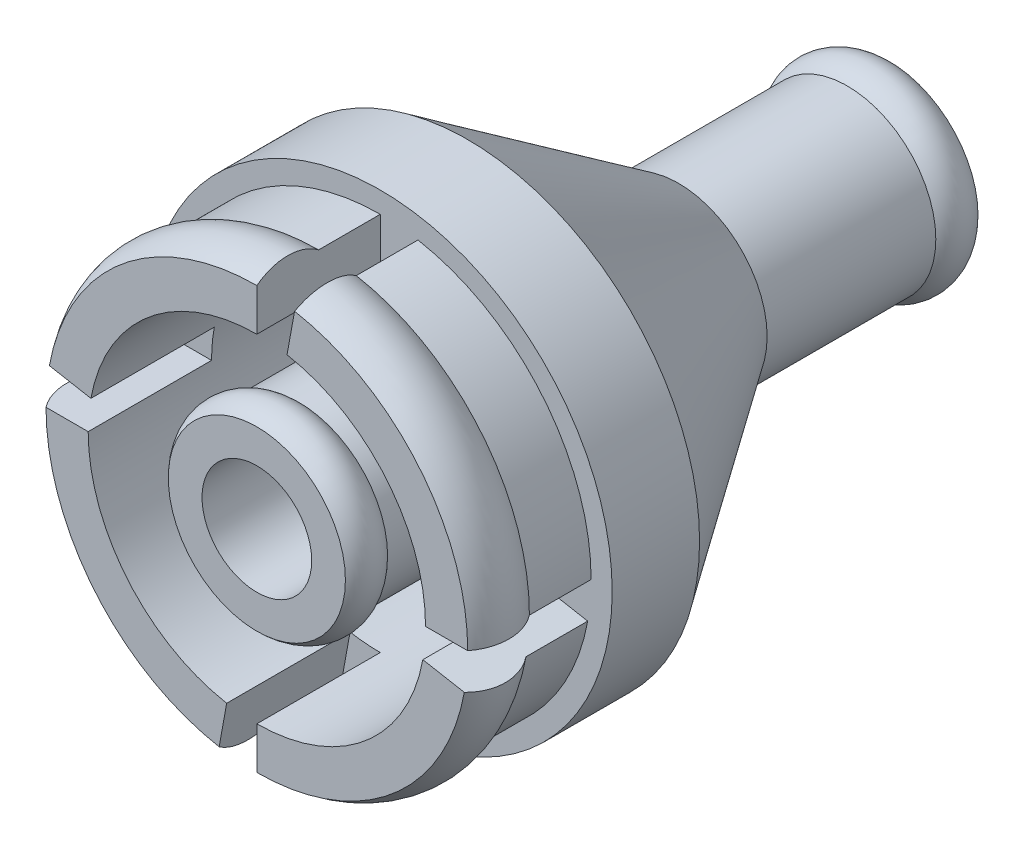
ISO-10303-21;
HEADER;
FILE_DESCRIPTION(('STEP AP214'),'2;1');
FILE_NAME('part.step','',(''),(''),'','','');
FILE_SCHEMA(('AUTOMOTIVE_DESIGN { 1 0 10303 214 1 1 1 1 }'));
ENDSEC;
DATA;
#1=APPLICATION_CONTEXT('core data for automotive mechanical design processes');
#2=APPLICATION_PROTOCOL_DEFINITION('international standard','automotive_design',2000,#1);
#3=PRODUCT_CONTEXT('',#1,'mechanical');
#4=PRODUCT('Part','Part','',(#3));
#5=PRODUCT_RELATED_PRODUCT_CATEGORY('part','',(#4));
#6=PRODUCT_DEFINITION_FORMATION('','',#4);
#7=PRODUCT_DEFINITION_CONTEXT('part definition',#1,'design');
#8=PRODUCT_DEFINITION('design','',#6,#7);
#9=PRODUCT_DEFINITION_SHAPE('','',#8);
#10=(LENGTH_UNIT() NAMED_UNIT(*) SI_UNIT(.MILLI.,.METRE.));
#11=(NAMED_UNIT(*) PLANE_ANGLE_UNIT() SI_UNIT($,.RADIAN.));
#12=(NAMED_UNIT(*) SI_UNIT($,.STERADIAN.) SOLID_ANGLE_UNIT());
#13=UNCERTAINTY_MEASURE_WITH_UNIT(LENGTH_MEASURE(1.E-05),#10,'distance_accuracy_value','');
#14=(GEOMETRIC_REPRESENTATION_CONTEXT(3) GLOBAL_UNCERTAINTY_ASSIGNED_CONTEXT((#13)) GLOBAL_UNIT_ASSIGNED_CONTEXT((#10,
#11,#12)) REPRESENTATION_CONTEXT('',''));
#15=CARTESIAN_POINT('',(0.,0.,0.));
#16=DIRECTION('',(0.,0.,1.));
#17=DIRECTION('',(1.,0.,0.));
#18=AXIS2_PLACEMENT_3D('',#15,#16,#17);
#19=CARTESIAN_POINT('',(0.,0.,15.));
#20=DIRECTION('',(0.,0.,1.));
#21=DIRECTION('',(1.,0.,0.));
#22=AXIS2_PLACEMENT_3D('',#19,#20,#21);
#23=CYLINDRICAL_SURFACE('',#22,5.);
#24=DIRECTION('',(0.,0.,1.));
#25=VECTOR('',#24,1.);
#26=CARTESIAN_POINT('',(-0.894427190999915,-4.91934955049954,15.));
#27=LINE('',#26,#25);
#28=CARTESIAN_POINT('',(-0.894427190999916,-4.91934955049954,13.5370032541715));
#29=VERTEX_POINT('',#28);
#30=CARTESIAN_POINT('',(-0.894427190999915,-4.91934955049954,12.0740065083429));
#31=VERTEX_POINT('',#30);
#32=EDGE_CURVE('E335',#29,#31,#27,.F.);
#33=ORIENTED_EDGE('',*,*,#32,.F.);
#34=CARTESIAN_POINT('',(0.,0.,13.5370032541715));
#35=DIRECTION('',(0.,0.,1.));
#36=DIRECTION('',(1.,0.,0.));
#37=AXIS2_PLACEMENT_3D('',#34,#35,#36);
#38=CIRCLE('',#37,5.);
#39=CARTESIAN_POINT('',(-5.,0.,13.5370032541715));
#40=VERTEX_POINT('',#39);
#41=EDGE_CURVE('E425',#40,#29,#38,.T.);
#42=ORIENTED_EDGE('',*,*,#41,.F.);
#43=DIRECTION('',(0.,0.,1.));
#44=VECTOR('',#43,1.);
#45=CARTESIAN_POINT('',(-5.,0.,15.));
#46=LINE('',#45,#44);
#47=CARTESIAN_POINT('',(-5.,0.,12.0740065083429));
#48=VERTEX_POINT('',#47);
#49=EDGE_CURVE('E318',#48,#40,#46,.T.);
#50=ORIENTED_EDGE('',*,*,#49,.F.);
#51=CARTESIAN_POINT('',(0.,0.,12.0740065083429));
#52=DIRECTION('',(0.,0.,1.));
#53=DIRECTION('',(1.,0.,0.));
#54=AXIS2_PLACEMENT_3D('',#51,#52,#53);
#55=CIRCLE('',#54,5.);
#56=EDGE_CURVE('E422',#48,#31,#55,.T.);
#57=ORIENTED_EDGE('',*,*,#56,.T.);
#58=EDGE_LOOP('',(#33,#42,#50,#57));
#59=FACE_BOUND('',#58,.T.);
#60=ADVANCED_FACE('F39',(#59),#23,.T.);
#61=DIRECTION('',(0.,0.,1.));
#62=VECTOR('',#61,1.);
#63=CARTESIAN_POINT('',(-4.91934955049954,0.894427190999915,15.));
#64=LINE('',#63,#62);
#65=CARTESIAN_POINT('',(-4.91934955049954,0.894427190999915,13.5370032541715));
#66=VERTEX_POINT('',#65);
#67=CARTESIAN_POINT('',(-4.91934955049954,0.894427190999915,12.0740065083429));
#68=VERTEX_POINT('',#67);
#69=EDGE_CURVE('E324',#66,#68,#64,.F.);
#70=ORIENTED_EDGE('',*,*,#69,.F.);
#71=CARTESIAN_POINT('',(0.,5.,13.5370032541715));
#72=VERTEX_POINT('',#71);
#73=EDGE_CURVE('E416',#72,#66,#38,.T.);
#74=ORIENTED_EDGE('',*,*,#73,.F.);
#75=DIRECTION('',(0.,0.,1.));
#76=VECTOR('',#75,1.);
#77=CARTESIAN_POINT('',(0.,5.,15.));
#78=LINE('',#77,#76);
#79=CARTESIAN_POINT('',(0.,5.,12.0740065083429));
#80=VERTEX_POINT('',#79);
#81=EDGE_CURVE('E307',#80,#72,#78,.T.);
#82=ORIENTED_EDGE('',*,*,#81,.F.);
#83=EDGE_CURVE('E720',#80,#68,#55,.T.);
#84=ORIENTED_EDGE('',*,*,#83,.T.);
#85=EDGE_LOOP('',(#70,#74,#82,#84));
#86=FACE_BOUND('',#85,.T.);
#87=ADVANCED_FACE('F367',(#86),#23,.T.);
#88=DIRECTION('',(0.,0.,1.));
#89=VECTOR('',#88,1.);
#90=CARTESIAN_POINT('',(0.894427190999915,4.91934955049954,15.));
#91=LINE('',#90,#89);
#92=CARTESIAN_POINT('',(0.894427190999915,4.91934955049954,13.5370032541715));
#93=VERTEX_POINT('',#92);
#94=CARTESIAN_POINT('',(0.894427190999915,4.91934955049954,12.0740065083429));
#95=VERTEX_POINT('',#94);
#96=EDGE_CURVE('E313',#93,#95,#91,.F.);
#97=ORIENTED_EDGE('',*,*,#96,.F.);
#98=CARTESIAN_POINT('',(5.,0.,13.5370032541715));
#99=VERTEX_POINT('',#98);
#100=EDGE_CURVE('E404',#99,#93,#38,.T.);
#101=ORIENTED_EDGE('',*,*,#100,.F.);
#102=DIRECTION('',(0.,0.,1.));
#103=VECTOR('',#102,1.);
#104=CARTESIAN_POINT('',(5.,0.,15.));
#105=LINE('',#104,#103);
#106=CARTESIAN_POINT('',(5.,0.,12.0740065083429));
#107=VERTEX_POINT('',#106);
#108=EDGE_CURVE('E294',#107,#99,#105,.T.);
#109=ORIENTED_EDGE('',*,*,#108,.F.);
#110=EDGE_CURVE('E406',#107,#95,#55,.T.);
#111=ORIENTED_EDGE('',*,*,#110,.T.);
#112=EDGE_LOOP('',(#97,#101,#109,#111));
#113=FACE_BOUND('',#112,.T.);
#114=ADVANCED_FACE('F374',(#113),#23,.T.);
#115=CARTESIAN_POINT('',(0.,0.,14.2685016270857));
#116=DIRECTION('',(0.,0.,1.));
#117=DIRECTION('',(1.,0.,0.));
#118=AXIS2_PLACEMENT_3D('',#115,#116,#117);
#119=TOROIDAL_SURFACE('',#118,4.04669276022607,1.2016174778113);
#120=CARTESIAN_POINT('',(-0.72389440767374,-3.98141924220557,14.2685016270857));
#121=DIRECTION('',(-0.983869910099908,0.178885438199983,0.));
#122=DIRECTION('',(-0.178885438199983,-0.983869910099908,0.));
#123=AXIS2_PLACEMENT_3D('',#120,#121,#122);
#124=CIRCLE('',#123,1.2016174778113);
#125=CARTESIAN_POINT('',(-0.894427190999915,-4.91934955049954,15.));
#126=VERTEX_POINT('',#125);
#127=EDGE_CURVE('E332',#126,#29,#124,.F.);
#128=ORIENTED_EDGE('',*,*,#127,.F.);
#129=CARTESIAN_POINT('',(0.,0.,15.));
#130=DIRECTION('',(0.,0.,1.));
#131=DIRECTION('',(1.,0.,0.));
#132=AXIS2_PLACEMENT_3D('',#129,#130,#131);
#133=CIRCLE('',#132,5.);
#134=CARTESIAN_POINT('',(-5.,0.,15.));
#135=VERTEX_POINT('',#134);
#136=EDGE_CURVE('E440',#135,#126,#133,.T.);
#137=ORIENTED_EDGE('',*,*,#136,.F.);
#138=CARTESIAN_POINT('',(-4.04669276022607,0.,14.2685016270857));
#139=DIRECTION('',(0.,-1.,0.));
#140=DIRECTION('',(0.,0.,-1.));
#141=AXIS2_PLACEMENT_3D('',#138,#139,#140);
#142=CIRCLE('',#141,1.2016174778113);
#143=EDGE_CURVE('E62',#40,#135,#142,.F.);
#144=ORIENTED_EDGE('',*,*,#143,.F.);
#145=ORIENTED_EDGE('',*,*,#41,.T.);
#146=EDGE_LOOP('',(#128,#137,#144,#145));
#147=FACE_BOUND('',#146,.T.);
#148=ADVANCED_FACE('F388',(#147),#119,.T.);
#149=CARTESIAN_POINT('',(-3.98141924220557,0.72389440767374,14.2685016270857));
#150=DIRECTION('',(0.178885438199983,0.983869910099908,0.));
#151=DIRECTION('',(-0.983869910099908,0.178885438199983,0.));
#152=AXIS2_PLACEMENT_3D('',#149,#150,#151);
#153=CIRCLE('',#152,1.2016174778113);
#154=CARTESIAN_POINT('',(-4.91934955049954,0.894427190999915,15.));
#155=VERTEX_POINT('',#154);
#156=EDGE_CURVE('E321',#155,#66,#153,.F.);
#157=ORIENTED_EDGE('',*,*,#156,.F.);
#158=CARTESIAN_POINT('',(0.,5.,15.));
#159=VERTEX_POINT('',#158);
#160=EDGE_CURVE('E237',#159,#155,#133,.T.);
#161=ORIENTED_EDGE('',*,*,#160,.F.);
#162=CARTESIAN_POINT('',(0.,4.04669276022607,14.2685016270857));
#163=DIRECTION('',(-1.,0.,0.));
#164=DIRECTION('',(0.,-1.,0.));
#165=AXIS2_PLACEMENT_3D('',#162,#163,#164);
#166=CIRCLE('',#165,1.2016174778113);
#167=EDGE_CURVE('E304',#72,#159,#166,.F.);
#168=ORIENTED_EDGE('',*,*,#167,.F.);
#169=ORIENTED_EDGE('',*,*,#73,.T.);
#170=EDGE_LOOP('',(#157,#161,#168,#169));
#171=FACE_BOUND('',#170,.T.);
#172=ADVANCED_FACE('F397',(#171),#119,.T.);
#173=CARTESIAN_POINT('',(0.72389440767374,3.98141924220557,14.2685016270857));
#174=DIRECTION('',(0.983869910099908,-0.178885438199983,0.));
#175=DIRECTION('',(0.178885438199983,0.983869910099908,0.));
#176=AXIS2_PLACEMENT_3D('',#173,#174,#175);
#177=CIRCLE('',#176,1.2016174778113);
#178=CARTESIAN_POINT('',(0.894427190999915,4.91934955049954,15.));
#179=VERTEX_POINT('',#178);
#180=EDGE_CURVE('E310',#179,#93,#177,.F.);
#181=ORIENTED_EDGE('',*,*,#180,.F.);
#182=CARTESIAN_POINT('',(5.,0.,15.));
#183=VERTEX_POINT('',#182);
#184=EDGE_CURVE('E429',#183,#179,#133,.T.);
#185=ORIENTED_EDGE('',*,*,#184,.F.);
#186=CARTESIAN_POINT('',(4.04669276022607,0.,14.2685016270857));
#187=DIRECTION('',(0.,1.,0.));
#188=DIRECTION('',(-1.,0.,0.));
#189=AXIS2_PLACEMENT_3D('',#186,#187,#188);
#190=CIRCLE('',#189,1.2016174778113);
#191=EDGE_CURVE('E291',#99,#183,#190,.F.);
#192=ORIENTED_EDGE('',*,*,#191,.F.);
#193=ORIENTED_EDGE('',*,*,#100,.T.);
#194=EDGE_LOOP('',(#181,#185,#192,#193));
#195=FACE_BOUND('',#194,.T.);
#196=ADVANCED_FACE('F389',(#195),#119,.T.);
#197=CARTESIAN_POINT('',(0.,0.,15.));
#198=DIRECTION('',(0.,0.,1.));
#199=DIRECTION('',(1.,0.,0.));
#200=AXIS2_PLACEMENT_3D('',#197,#198,#199);
#201=PLANE('',#200);
#202=DIRECTION('',(-0.178885438199983,-0.983869910099907,0.));
#203=VECTOR('',#202,1.);
#204=CARTESIAN_POINT('',(-0.983869910099907,-5.41128450554949,15.));
#205=LINE('',#204,#203);
#206=CARTESIAN_POINT('',(-0.715541752799932,-3.93547964039963,15.));
#207=VERTEX_POINT('',#206);
#208=EDGE_CURVE('E193',#207,#126,#205,.T.);
#209=ORIENTED_EDGE('',*,*,#208,.F.);
#210=CARTESIAN_POINT('',(0.,0.,15.));
#211=DIRECTION('',(0.,0.,1.));
#212=DIRECTION('',(1.,0.,0.));
#213=AXIS2_PLACEMENT_3D('',#210,#211,#212);
#214=CIRCLE('',#213,4.);
#215=CARTESIAN_POINT('',(-4.,0.,15.));
#216=VERTEX_POINT('',#215);
#217=EDGE_CURVE('E199',#216,#207,#214,.T.);
#218=ORIENTED_EDGE('',*,*,#217,.F.);
#219=DIRECTION('',(1.,0.,0.));
#220=VECTOR('',#219,1.);
#221=CARTESIAN_POINT('',(0.,0.,15.));
#222=LINE('',#221,#220);
#223=EDGE_CURVE('E48',#135,#216,#222,.T.);
#224=ORIENTED_EDGE('',*,*,#223,.F.);
#225=ORIENTED_EDGE('',*,*,#136,.T.);
#226=EDGE_LOOP('',(#209,#218,#224,#225));
#227=FACE_BOUND('',#226,.T.);
#228=ADVANCED_FACE('F537',(#227),#201,.T.);
#229=DIRECTION('',(-0.983869910099907,0.178885438199983,0.));
#230=VECTOR('',#229,1.);
#231=CARTESIAN_POINT('',(-5.41128450554949,0.983869910099907,15.));
#232=LINE('',#231,#230);
#233=CARTESIAN_POINT('',(-3.93547964039963,0.715541752799932,15.));
#234=VERTEX_POINT('',#233);
#235=EDGE_CURVE('E236',#234,#155,#232,.T.);
#236=ORIENTED_EDGE('',*,*,#235,.F.);
#237=CARTESIAN_POINT('',(0.,4.,15.));
#238=VERTEX_POINT('',#237);
#239=EDGE_CURVE('E206',#238,#234,#214,.T.);
#240=ORIENTED_EDGE('',*,*,#239,.F.);
#241=DIRECTION('',(0.,-1.,0.));
#242=VECTOR('',#241,1.);
#243=CARTESIAN_POINT('',(0.,0.,15.));
#244=LINE('',#243,#242);
#245=EDGE_CURVE('E234',#159,#238,#244,.T.);
#246=ORIENTED_EDGE('',*,*,#245,.F.);
#247=ORIENTED_EDGE('',*,*,#160,.T.);
#248=EDGE_LOOP('',(#236,#240,#246,#247));
#249=FACE_BOUND('',#248,.T.);
#250=ADVANCED_FACE('F232',(#249),#201,.T.);
#251=DIRECTION('',(0.178885438199983,0.983869910099908,0.));
#252=VECTOR('',#251,1.);
#253=CARTESIAN_POINT('',(0.983869910099906,5.41128450554949,15.));
#254=LINE('',#253,#252);
#255=CARTESIAN_POINT('',(0.715541752799932,3.93547964039963,15.));
#256=VERTEX_POINT('',#255);
#257=EDGE_CURVE('E266',#256,#179,#254,.T.);
#258=ORIENTED_EDGE('',*,*,#257,.F.);
#259=CARTESIAN_POINT('',(4.,0.,15.));
#260=VERTEX_POINT('',#259);
#261=EDGE_CURVE('E202',#260,#256,#214,.T.);
#262=ORIENTED_EDGE('',*,*,#261,.F.);
#263=DIRECTION('',(-1.,0.,0.));
#264=VECTOR('',#263,1.);
#265=CARTESIAN_POINT('',(0.,0.,15.));
#266=LINE('',#265,#264);
#267=EDGE_CURVE('E734',#183,#260,#266,.T.);
#268=ORIENTED_EDGE('',*,*,#267,.F.);
#269=ORIENTED_EDGE('',*,*,#184,.T.);
#270=EDGE_LOOP('',(#258,#262,#268,#269));
#271=FACE_BOUND('',#270,.T.);
#272=ADVANCED_FACE('F553',(#271),#201,.T.);
#273=CARTESIAN_POINT('',(0.,0.,15.));
#274=DIRECTION('',(0.,0.,1.));
#275=DIRECTION('',(1.,0.,0.));
#276=AXIS2_PLACEMENT_3D('',#273,#274,#275);
#277=CIRCLE('',#276,1.3);
#278=CARTESIAN_POINT('',(1.3,0.,15.));
#279=VERTEX_POINT('',#278);
#280=EDGE_CURVE('E730',#279,#279,#277,.T.);
#281=ORIENTED_EDGE('',*,*,#280,.F.);
#282=EDGE_LOOP('',(#281));
#283=FACE_BOUND('',#282,.T.);
#284=CARTESIAN_POINT('',(0.,0.,15.));
#285=DIRECTION('',(0.,0.,1.));
#286=DIRECTION('',(1.,0.,0.));
#287=AXIS2_PLACEMENT_3D('',#284,#285,#286);
#288=CIRCLE('',#287,2.1);
#289=CARTESIAN_POINT('',(2.1,0.,15.));
#290=VERTEX_POINT('',#289);
#291=EDGE_CURVE('E213',#290,#290,#288,.T.);
#292=ORIENTED_EDGE('',*,*,#291,.T.);
#293=EDGE_LOOP('',(#292));
#294=FACE_BOUND('',#293,.T.);
#295=ADVANCED_FACE('F560',(#283,#294),#201,.T.);
#296=CARTESIAN_POINT('',(0.,0.,0.));
#297=DIRECTION('',(0.,0.,1.));
#298=DIRECTION('',(1.,0.,0.));
#299=AXIS2_PLACEMENT_3D('',#296,#297,#298);
#300=PLANE('',#299);
#301=CARTESIAN_POINT('',(0.,0.,0.));
#302=DIRECTION('',(0.,0.,1.));
#303=DIRECTION('',(1.,0.,0.));
#304=AXIS2_PLACEMENT_3D('',#301,#302,#303);
#305=CIRCLE('',#304,1.3);
#306=CARTESIAN_POINT('',(1.3,0.,0.));
#307=VERTEX_POINT('',#306);
#308=EDGE_CURVE('E729',#307,#307,#305,.T.);
#309=ORIENTED_EDGE('',*,*,#308,.T.);
#310=EDGE_LOOP('',(#309));
#311=FACE_BOUND('',#310,.T.);
#312=CARTESIAN_POINT('',(0.,0.,0.));
#313=DIRECTION('',(0.,0.,1.));
#314=DIRECTION('',(1.,0.,0.));
#315=AXIS2_PLACEMENT_3D('',#312,#313,#314);
#316=CIRCLE('',#315,2.09999999999988);
#317=CARTESIAN_POINT('',(2.09999999999988,0.,0.));
#318=VERTEX_POINT('',#317);
#319=EDGE_CURVE('E338',#318,#318,#316,.T.);
#320=ORIENTED_EDGE('',*,*,#319,.F.);
#321=EDGE_LOOP('',(#320));
#322=FACE_BOUND('',#321,.T.);
#323=ADVANCED_FACE('F569',(#311,#322),#300,.F.);
#324=CARTESIAN_POINT('',(0.,0.,15.));
#325=DIRECTION('',(0.,0.,-1.));
#326=DIRECTION('',(-1.,0.,0.));
#327=AXIS2_PLACEMENT_3D('',#324,#325,#326);
#328=CYLINDRICAL_SURFACE('',#327,1.3);
#329=ORIENTED_EDGE('',*,*,#280,.T.);
#330=EDGE_LOOP('',(#329));
#331=FACE_BOUND('',#330,.T.);
#332=ORIENTED_EDGE('',*,*,#308,.F.);
#333=EDGE_LOOP('',(#332));
#334=FACE_BOUND('',#333,.T.);
#335=ADVANCED_FACE('F363',(#331,#334),#328,.F.);
#336=CARTESIAN_POINT('',(0.,0.,0.5));
#337=DIRECTION('',(0.,0.,1.));
#338=DIRECTION('',(1.,0.,0.));
#339=AXIS2_PLACEMENT_3D('',#336,#337,#338);
#340=TOROIDAL_SURFACE('',#339,1.6,0.707106781186513);
#341=ORIENTED_EDGE('',*,*,#319,.T.);
#342=EDGE_LOOP('',(#341));
#343=FACE_BOUND('',#342,.T.);
#344=CARTESIAN_POINT('',(0.,0.,0.999999999999994));
#345=DIRECTION('',(0.,0.,1.));
#346=DIRECTION('',(1.,0.,0.));
#347=AXIS2_PLACEMENT_3D('',#344,#345,#346);
#348=CIRCLE('',#347,2.10000000000001);
#349=CARTESIAN_POINT('',(2.10000000000001,0.,0.999999999999994));
#350=VERTEX_POINT('',#349);
#351=EDGE_CURVE('E200',#350,#350,#348,.T.);
#352=ORIENTED_EDGE('',*,*,#351,.F.);
#353=EDGE_LOOP('',(#352));
#354=FACE_BOUND('',#353,.T.);
#355=ADVANCED_FACE('F355',(#343,#354),#340,.T.);
#356=CARTESIAN_POINT('',(0.,0.,15.));
#357=DIRECTION('',(0.,0.,1.));
#358=DIRECTION('',(1.,0.,0.));
#359=AXIS2_PLACEMENT_3D('',#356,#357,#358);
#360=CYLINDRICAL_SURFACE('',#359,2.10000000000001);
#361=ORIENTED_EDGE('',*,*,#351,.T.);
#362=EDGE_LOOP('',(#361));
#363=FACE_BOUND('',#362,.T.);
#364=CARTESIAN_POINT('',(0.,0.,4.99999999999999));
#365=DIRECTION('',(0.,0.,1.));
#366=DIRECTION('',(1.,0.,0.));
#367=AXIS2_PLACEMENT_3D('',#364,#365,#366);
#368=CIRCLE('',#367,2.10000000000001);
#369=CARTESIAN_POINT('',(2.10000000000001,0.,4.99999999999999));
#370=VERTEX_POINT('',#369);
#371=EDGE_CURVE('E208',#370,#370,#368,.T.);
#372=ORIENTED_EDGE('',*,*,#371,.F.);
#373=EDGE_LOOP('',(#372));
#374=FACE_BOUND('',#373,.T.);
#375=ADVANCED_FACE('F353',(#363,#374),#360,.T.);
#376=CARTESIAN_POINT('',(0.,0.,10.0019356835869));
#377=DIRECTION('',(0.,0.,1.));
#378=DIRECTION('',(1.,0.,0.));
#379=AXIS2_PLACEMENT_3D('',#376,#377,#378);
#380=CONICAL_SURFACE('',#379,5.5,0.596996691398709);
#381=ORIENTED_EDGE('',*,*,#371,.T.);
#382=EDGE_LOOP('',(#381));
#383=FACE_BOUND('',#382,.T.);
#384=CARTESIAN_POINT('',(0.,0.,10.0019356835869));
#385=DIRECTION('',(0.,0.,1.));
#386=DIRECTION('',(1.,0.,0.));
#387=AXIS2_PLACEMENT_3D('',#384,#385,#386);
#388=CIRCLE('',#387,5.5);
#389=CARTESIAN_POINT('',(5.5,0.,10.0019356835869));
#390=VERTEX_POINT('',#389);
#391=EDGE_CURVE('E342',#390,#390,#388,.T.);
#392=ORIENTED_EDGE('',*,*,#391,.F.);
#393=EDGE_LOOP('',(#392));
#394=FACE_BOUND('',#393,.T.);
#395=ADVANCED_FACE('F350',(#383,#394),#380,.T.);
#396=CARTESIAN_POINT('',(0.,0.,15.));
#397=DIRECTION('',(0.,0.,1.));
#398=DIRECTION('',(1.,0.,0.));
#399=AXIS2_PLACEMENT_3D('',#396,#397,#398);
#400=CYLINDRICAL_SURFACE('',#399,4.);
#401=DIRECTION('',(0.,0.,1.));
#402=VECTOR('',#401,1.);
#403=CARTESIAN_POINT('',(-0.715541752799932,-3.93547964039963,10.2258387790488));
#404=LINE('',#403,#402);
#405=CARTESIAN_POINT('',(-0.715541752799932,-3.93547964039963,12.0740065083429));
#406=VERTEX_POINT('',#405);
#407=EDGE_CURVE('E192',#406,#207,#404,.T.);
#408=ORIENTED_EDGE('',*,*,#407,.F.);
#409=CARTESIAN_POINT('',(0.,0.,12.0740065083429));
#410=DIRECTION('',(0.,0.,1.));
#411=DIRECTION('',(1.,0.,0.));
#412=AXIS2_PLACEMENT_3D('',#409,#410,#411);
#413=CIRCLE('',#412,4.);
#414=CARTESIAN_POINT('',(0.,-4.,12.0740065083429));
#415=VERTEX_POINT('',#414);
#416=EDGE_CURVE('E190',#406,#415,#413,.T.);
#417=ORIENTED_EDGE('',*,*,#416,.T.);
#418=DIRECTION('',(0.,0.,1.));
#419=VECTOR('',#418,1.);
#420=CARTESIAN_POINT('',(0.,-4.,10.2258387790488));
#421=LINE('',#420,#419);
#422=CARTESIAN_POINT('',(0.,-4.,15.));
#423=VERTEX_POINT('',#422);
#424=EDGE_CURVE('E175',#415,#423,#421,.T.);
#425=ORIENTED_EDGE('',*,*,#424,.T.);
#426=CARTESIAN_POINT('',(3.93547964039963,-0.715541752799932,15.));
#427=VERTEX_POINT('',#426);
#428=EDGE_CURVE('E188',#423,#427,#214,.T.);
#429=ORIENTED_EDGE('',*,*,#428,.T.);
#430=DIRECTION('',(0.,0.,1.));
#431=VECTOR('',#430,1.);
#432=CARTESIAN_POINT('',(3.93547964039963,-0.715541752799932,10.2258387790488));
#433=LINE('',#432,#431);
#434=CARTESIAN_POINT('',(3.93547964039963,-0.715541752799932,12.0740065083429));
#435=VERTEX_POINT('',#434);
#436=EDGE_CURVE('E279',#435,#427,#433,.T.);
#437=ORIENTED_EDGE('',*,*,#436,.F.);
#438=CARTESIAN_POINT('',(0.,0.,12.0740065083429));
#439=DIRECTION('',(0.,0.,1.));
#440=DIRECTION('',(1.,0.,0.));
#441=AXIS2_PLACEMENT_3D('',#438,#439,#440);
#442=CIRCLE('',#441,4.);
#443=CARTESIAN_POINT('',(4.,0.,12.0740065083429));
#444=VERTEX_POINT('',#443);
#445=EDGE_CURVE('E274',#435,#444,#442,.T.);
#446=ORIENTED_EDGE('',*,*,#445,.T.);
#447=DIRECTION('',(0.,0.,1.));
#448=VECTOR('',#447,1.);
#449=CARTESIAN_POINT('',(4.,0.,10.2258387790488));
#450=LINE('',#449,#448);
#451=EDGE_CURVE('E284',#444,#260,#450,.T.);
#452=ORIENTED_EDGE('',*,*,#451,.T.);
#453=ORIENTED_EDGE('',*,*,#261,.T.);
#454=DIRECTION('',(0.,0.,1.));
#455=VECTOR('',#454,1.);
#456=CARTESIAN_POINT('',(0.715541752799932,3.93547964039963,10.2258387790488));
#457=LINE('',#456,#455);
#458=CARTESIAN_POINT('',(0.715541752799932,3.93547964039963,12.0740065083429));
#459=VERTEX_POINT('',#458);
#460=EDGE_CURVE('E263',#459,#256,#457,.T.);
#461=ORIENTED_EDGE('',*,*,#460,.F.);
#462=CARTESIAN_POINT('',(0.,0.,12.0740065083429));
#463=DIRECTION('',(0.,0.,1.));
#464=DIRECTION('',(1.,0.,0.));
#465=AXIS2_PLACEMENT_3D('',#462,#463,#464);
#466=CIRCLE('',#465,4.);
#467=CARTESIAN_POINT('',(0.,4.,12.0740065083429));
#468=VERTEX_POINT('',#467);
#469=EDGE_CURVE('E260',#459,#468,#466,.T.);
#470=ORIENTED_EDGE('',*,*,#469,.T.);
#471=DIRECTION('',(0.,0.,1.));
#472=VECTOR('',#471,1.);
#473=CARTESIAN_POINT('',(0.,4.,10.2258387790488));
#474=LINE('',#473,#472);
#475=EDGE_CURVE('E228',#468,#238,#474,.T.);
#476=ORIENTED_EDGE('',*,*,#475,.T.);
#477=ORIENTED_EDGE('',*,*,#239,.T.);
#478=DIRECTION('',(0.,0.,1.));
#479=VECTOR('',#478,1.);
#480=CARTESIAN_POINT('',(-3.93547964039963,0.715541752799932,10.2258387790488));
#481=LINE('',#480,#479);
#482=CARTESIAN_POINT('',(-3.93547964039963,0.715541752799932,12.0740065083429));
#483=VERTEX_POINT('',#482);
#484=EDGE_CURVE('E226',#483,#234,#481,.T.);
#485=ORIENTED_EDGE('',*,*,#484,.F.);
#486=CARTESIAN_POINT('',(0.,0.,12.0740065083429));
#487=DIRECTION('',(0.,0.,1.));
#488=DIRECTION('',(1.,0.,0.));
#489=AXIS2_PLACEMENT_3D('',#486,#487,#488);
#490=CIRCLE('',#489,4.);
#491=CARTESIAN_POINT('',(-4.,0.,12.0740065083429));
#492=VERTEX_POINT('',#491);
#493=EDGE_CURVE('E255',#483,#492,#490,.T.);
#494=ORIENTED_EDGE('',*,*,#493,.T.);
#495=DIRECTION('',(0.,0.,1.));
#496=VECTOR('',#495,1.);
#497=CARTESIAN_POINT('',(-4.,0.,10.2258387790488));
#498=LINE('',#497,#496);
#499=EDGE_CURVE('E241',#492,#216,#498,.T.);
#500=ORIENTED_EDGE('',*,*,#499,.T.);
#501=ORIENTED_EDGE('',*,*,#217,.T.);
#502=EDGE_LOOP('',(#408,#417,#425,#429,#437,#446,#452,#453,#461,#470,#476,#477,#485,#494,#500,#501));
#503=FACE_BOUND('',#502,.T.);
#504=CARTESIAN_POINT('',(0.,0.,10.));
#505=DIRECTION('',(0.,0.,1.));
#506=DIRECTION('',(1.,0.,0.));
#507=AXIS2_PLACEMENT_3D('',#504,#505,#506);
#508=CIRCLE('',#507,4.);
#509=CARTESIAN_POINT('',(4.,0.,10.));
#510=VERTEX_POINT('',#509);
#511=EDGE_CURVE('E443',#510,#510,#508,.T.);
#512=ORIENTED_EDGE('',*,*,#511,.F.);
#513=EDGE_LOOP('',(#512));
#514=FACE_BOUND('',#513,.T.);
#515=ADVANCED_FACE('F185',(#503,#514),#400,.F.);
#516=CARTESIAN_POINT('',(-4.,0.,10.));
#517=DIRECTION('',(0.,0.,1.));
#518=DIRECTION('',(1.,0.,0.));
#519=AXIS2_PLACEMENT_3D('',#516,#517,#518);
#520=PLANE('',#519);
#521=ORIENTED_EDGE('',*,*,#511,.T.);
#522=EDGE_LOOP('',(#521));
#523=FACE_BOUND('',#522,.T.);
#524=CARTESIAN_POINT('',(0.,0.,10.));
#525=DIRECTION('',(0.,0.,1.));
#526=DIRECTION('',(1.,0.,0.));
#527=AXIS2_PLACEMENT_3D('',#524,#525,#526);
#528=CIRCLE('',#527,2.1);
#529=CARTESIAN_POINT('',(2.1,0.,10.));
#530=VERTEX_POINT('',#529);
#531=EDGE_CURVE('E448',#530,#530,#528,.T.);
#532=ORIENTED_EDGE('',*,*,#531,.F.);
#533=EDGE_LOOP('',(#532));
#534=FACE_BOUND('',#533,.T.);
#535=ADVANCED_FACE('F464',(#523,#534),#520,.T.);
#536=CARTESIAN_POINT('',(0.,0.,15.));
#537=DIRECTION('',(0.,0.,1.));
#538=DIRECTION('',(1.,0.,0.));
#539=AXIS2_PLACEMENT_3D('',#536,#537,#538);
#540=CYLINDRICAL_SURFACE('',#539,2.1);
#541=ORIENTED_EDGE('',*,*,#531,.T.);
#542=EDGE_LOOP('',(#541));
#543=FACE_BOUND('',#542,.T.);
#544=CARTESIAN_POINT('',(0.,0.,14.));
#545=DIRECTION('',(0.,0.,1.));
#546=DIRECTION('',(1.,0.,0.));
#547=AXIS2_PLACEMENT_3D('',#544,#545,#546);
#548=CIRCLE('',#547,2.1);
#549=CARTESIAN_POINT('',(2.1,0.,14.));
#550=VERTEX_POINT('',#549);
#551=EDGE_CURVE('E220',#550,#550,#548,.T.);
#552=ORIENTED_EDGE('',*,*,#551,.F.);
#553=EDGE_LOOP('',(#552));
#554=FACE_BOUND('',#553,.T.);
#555=ADVANCED_FACE('F462',(#543,#554),#540,.T.);
#556=CARTESIAN_POINT('',(0.,0.,14.5));
#557=DIRECTION('',(0.,0.,1.));
#558=DIRECTION('',(1.,0.,0.));
#559=AXIS2_PLACEMENT_3D('',#556,#557,#558);
#560=TOROIDAL_SURFACE('',#559,1.6,0.707106781186548);
#561=ORIENTED_EDGE('',*,*,#551,.T.);
#562=EDGE_LOOP('',(#561));
#563=FACE_BOUND('',#562,.T.);
#564=ORIENTED_EDGE('',*,*,#291,.F.);
#565=EDGE_LOOP('',(#564));
#566=FACE_BOUND('',#565,.T.);
#567=ADVANCED_FACE('F459',(#563,#566),#560,.T.);
#568=CARTESIAN_POINT('',(0.,0.,15.));
#569=DIRECTION('',(0.,0.,-1.));
#570=DIRECTION('',(-1.,0.,0.));
#571=AXIS2_PLACEMENT_3D('',#568,#569,#570);
#572=CYLINDRICAL_SURFACE('',#571,5.5);
#573=CARTESIAN_POINT('',(0.,0.,12.0740065083429));
#574=DIRECTION('',(0.,0.,1.));
#575=DIRECTION('',(1.,0.,0.));
#576=AXIS2_PLACEMENT_3D('',#573,#574,#575);
#577=CIRCLE('',#576,5.5);
#578=CARTESIAN_POINT('',(5.5,0.,12.0740065083429));
#579=VERTEX_POINT('',#578);
#580=EDGE_CURVE('E725',#579,#579,#577,.T.);
#581=ORIENTED_EDGE('',*,*,#580,.F.);
#582=EDGE_LOOP('',(#581));
#583=FACE_BOUND('',#582,.T.);
#584=ORIENTED_EDGE('',*,*,#391,.T.);
#585=EDGE_LOOP('',(#584));
#586=FACE_BOUND('',#585,.T.);
#587=ADVANCED_FACE('F41',(#583,#586),#572,.T.);
#588=CARTESIAN_POINT('',(-5.5,0.,12.0740065083429));
#589=DIRECTION('',(0.,0.,1.));
#590=DIRECTION('',(1.,0.,0.));
#591=AXIS2_PLACEMENT_3D('',#588,#589,#590);
#592=PLANE('',#591);
#593=ORIENTED_EDGE('',*,*,#580,.T.);
#594=EDGE_LOOP('',(#593));
#595=FACE_BOUND('',#594,.T.);
#596=CARTESIAN_POINT('',(0.,-5.,12.0740065083429));
#597=VERTEX_POINT('',#596);
#598=CARTESIAN_POINT('',(4.91934955049954,-0.894427190999915,12.0740065083429));
#599=VERTEX_POINT('',#598);
#600=EDGE_CURVE('E415',#597,#599,#55,.T.);
#601=ORIENTED_EDGE('',*,*,#600,.F.);
#602=DIRECTION('',(0.,-1.,0.));
#603=VECTOR('',#602,1.);
#604=CARTESIAN_POINT('',(0.,-4.,12.0740065083429));
#605=LINE('',#604,#603);
#606=EDGE_CURVE('E295',#415,#597,#605,.T.);
#607=ORIENTED_EDGE('',*,*,#606,.F.);
#608=ORIENTED_EDGE('',*,*,#416,.F.);
#609=DIRECTION('',(0.178885438199983,0.983869910099908,0.));
#610=VECTOR('',#609,1.);
#611=CARTESIAN_POINT('',(-0.983869910099907,-5.41128450554949,12.0740065083429));
#612=LINE('',#611,#610);
#613=EDGE_CURVE('E708',#31,#406,#612,.T.);
#614=ORIENTED_EDGE('',*,*,#613,.F.);
#615=ORIENTED_EDGE('',*,*,#56,.F.);
#616=DIRECTION('',(-1.,0.,0.));
#617=VECTOR('',#616,1.);
#618=CARTESIAN_POINT('',(-4.,0.,12.0740065083429));
#619=LINE('',#618,#617);
#620=EDGE_CURVE('E257',#492,#48,#619,.T.);
#621=ORIENTED_EDGE('',*,*,#620,.F.);
#622=ORIENTED_EDGE('',*,*,#493,.F.);
#623=DIRECTION('',(0.983869910099908,-0.178885438199983,0.));
#624=VECTOR('',#623,1.);
#625=CARTESIAN_POINT('',(-5.41128450554949,0.983869910099907,12.0740065083429));
#626=LINE('',#625,#624);
#627=EDGE_CURVE('E252',#68,#483,#626,.T.);
#628=ORIENTED_EDGE('',*,*,#627,.F.);
#629=ORIENTED_EDGE('',*,*,#83,.F.);
#630=DIRECTION('',(0.,1.,0.));
#631=VECTOR('',#630,1.);
#632=CARTESIAN_POINT('',(0.,4.,12.0740065083429));
#633=LINE('',#632,#631);
#634=EDGE_CURVE('E242',#468,#80,#633,.T.);
#635=ORIENTED_EDGE('',*,*,#634,.F.);
#636=ORIENTED_EDGE('',*,*,#469,.F.);
#637=DIRECTION('',(-0.178885438199983,-0.983869910099908,0.));
#638=VECTOR('',#637,1.);
#639=CARTESIAN_POINT('',(0.983869910099906,5.41128450554949,12.0740065083429));
#640=LINE('',#639,#638);
#641=EDGE_CURVE('E248',#95,#459,#640,.T.);
#642=ORIENTED_EDGE('',*,*,#641,.F.);
#643=ORIENTED_EDGE('',*,*,#110,.F.);
#644=DIRECTION('',(1.,0.,0.));
#645=VECTOR('',#644,1.);
#646=CARTESIAN_POINT('',(4.,0.,12.0740065083429));
#647=LINE('',#646,#645);
#648=EDGE_CURVE('E269',#444,#107,#647,.T.);
#649=ORIENTED_EDGE('',*,*,#648,.F.);
#650=ORIENTED_EDGE('',*,*,#445,.F.);
#651=DIRECTION('',(-0.983869910099908,0.178885438199983,0.));
#652=VECTOR('',#651,1.);
#653=CARTESIAN_POINT('',(5.41128450554949,-0.983869910099907,12.0740065083429));
#654=LINE('',#653,#652);
#655=EDGE_CURVE('E278',#599,#435,#654,.T.);
#656=ORIENTED_EDGE('',*,*,#655,.F.);
#657=EDGE_LOOP('',(#601,#607,#608,#614,#615,#621,#622,#628,#629,#635,#636,#642,#643,#649,#650,#656));
#658=FACE_BOUND('',#657,.T.);
#659=ADVANCED_FACE('F381',(#595,#658),#592,.T.);
#660=DIRECTION('',(0.,0.,1.));
#661=VECTOR('',#660,1.);
#662=CARTESIAN_POINT('',(0.,-5.,15.));
#663=LINE('',#662,#661);
#664=CARTESIAN_POINT('',(0.,-5.,13.5370032541715));
#665=VERTEX_POINT('',#664);
#666=EDGE_CURVE('E329',#597,#665,#663,.T.);
#667=ORIENTED_EDGE('',*,*,#666,.F.);
#668=ORIENTED_EDGE('',*,*,#600,.T.);
#669=DIRECTION('',(0.,0.,1.));
#670=VECTOR('',#669,1.);
#671=CARTESIAN_POINT('',(4.91934955049954,-0.894427190999915,15.));
#672=LINE('',#671,#670);
#673=CARTESIAN_POINT('',(4.91934955049954,-0.894427190999916,13.5370032541715));
#674=VERTEX_POINT('',#673);
#675=EDGE_CURVE('E301',#674,#599,#672,.F.);
#676=ORIENTED_EDGE('',*,*,#675,.F.);
#677=EDGE_CURVE('E418',#665,#674,#38,.T.);
#678=ORIENTED_EDGE('',*,*,#677,.F.);
#679=EDGE_LOOP('',(#667,#668,#676,#678));
#680=FACE_BOUND('',#679,.T.);
#681=ADVANCED_FACE('F370',(#680),#23,.T.);
#682=CARTESIAN_POINT('',(0.,-4.04669276022607,14.2685016270857));
#683=DIRECTION('',(1.,0.,0.));
#684=DIRECTION('',(0.,0.,-1.));
#685=AXIS2_PLACEMENT_3D('',#682,#683,#684);
#686=CIRCLE('',#685,1.2016174778113);
#687=CARTESIAN_POINT('',(0.,-5.,15.));
#688=VERTEX_POINT('',#687);
#689=EDGE_CURVE('E54',#665,#688,#686,.F.);
#690=ORIENTED_EDGE('',*,*,#689,.F.);
#691=ORIENTED_EDGE('',*,*,#677,.T.);
#692=CARTESIAN_POINT('',(3.98141924220557,-0.72389440767374,14.2685016270857));
#693=DIRECTION('',(-0.178885438199983,-0.983869910099908,0.));
#694=DIRECTION('',(0.983869910099908,-0.178885438199983,0.));
#695=AXIS2_PLACEMENT_3D('',#692,#693,#694);
#696=CIRCLE('',#695,1.2016174778113);
#697=CARTESIAN_POINT('',(4.91934955049954,-0.894427190999915,15.));
#698=VERTEX_POINT('',#697);
#699=EDGE_CURVE('E298',#698,#674,#696,.F.);
#700=ORIENTED_EDGE('',*,*,#699,.F.);
#701=EDGE_CURVE('E435',#688,#698,#133,.T.);
#702=ORIENTED_EDGE('',*,*,#701,.F.);
#703=EDGE_LOOP('',(#690,#691,#700,#702));
#704=FACE_BOUND('',#703,.T.);
#705=ADVANCED_FACE('F380',(#704),#119,.T.);
#706=DIRECTION('',(0.,1.,0.));
#707=VECTOR('',#706,1.);
#708=CARTESIAN_POINT('',(0.,0.,15.));
#709=LINE('',#708,#707);
#710=EDGE_CURVE('E11',#688,#423,#709,.T.);
#711=ORIENTED_EDGE('',*,*,#710,.F.);
#712=ORIENTED_EDGE('',*,*,#701,.T.);
#713=DIRECTION('',(0.983869910099908,-0.178885438199983,0.));
#714=VECTOR('',#713,1.);
#715=CARTESIAN_POINT('',(5.41128450554949,-0.983869910099907,15.));
#716=LINE('',#715,#714);
#717=EDGE_CURVE('E197',#427,#698,#716,.T.);
#718=ORIENTED_EDGE('',*,*,#717,.F.);
#719=ORIENTED_EDGE('',*,*,#428,.F.);
#720=EDGE_LOOP('',(#711,#712,#718,#719));
#721=FACE_BOUND('',#720,.T.);
#722=ADVANCED_FACE('F196',(#721),#201,.T.);
#723=CARTESIAN_POINT('',(5.41128450554949,-0.983869910099907,10.2258387790488));
#724=DIRECTION('',(-0.178885438199983,-0.983869910099908,0.));
#725=DIRECTION('',(0.983869910099908,-0.178885438199983,0.));
#726=AXIS2_PLACEMENT_3D('',#723,#724,#725);
#727=PLANE('',#726);
#728=ORIENTED_EDGE('',*,*,#675,.T.);
#729=ORIENTED_EDGE('',*,*,#655,.T.);
#730=ORIENTED_EDGE('',*,*,#436,.T.);
#731=ORIENTED_EDGE('',*,*,#717,.T.);
#732=ORIENTED_EDGE('',*,*,#699,.T.);
#733=EDGE_LOOP('',(#728,#729,#730,#731,#732));
#734=FACE_BOUND('',#733,.T.);
#735=ADVANCED_FACE('F604',(#734),#727,.F.);
#736=CARTESIAN_POINT('',(4.,0.,10.2258387790488));
#737=DIRECTION('',(0.,1.,0.));
#738=DIRECTION('',(-1.,0.,0.));
#739=AXIS2_PLACEMENT_3D('',#736,#737,#738);
#740=PLANE('',#739);
#741=ORIENTED_EDGE('',*,*,#108,.T.);
#742=ORIENTED_EDGE('',*,*,#191,.T.);
#743=ORIENTED_EDGE('',*,*,#267,.T.);
#744=ORIENTED_EDGE('',*,*,#451,.F.);
#745=ORIENTED_EDGE('',*,*,#648,.T.);
#746=EDGE_LOOP('',(#741,#742,#743,#744,#745));
#747=FACE_BOUND('',#746,.T.);
#748=ADVANCED_FACE('F638',(#747),#740,.F.);
#749=CARTESIAN_POINT('',(0.983869910099906,5.41128450554949,10.2258387790488));
#750=DIRECTION('',(0.983869910099908,-0.178885438199983,0.));
#751=DIRECTION('',(0.178885438199983,0.983869910099908,0.));
#752=AXIS2_PLACEMENT_3D('',#749,#750,#751);
#753=PLANE('',#752);
#754=ORIENTED_EDGE('',*,*,#96,.T.);
#755=ORIENTED_EDGE('',*,*,#641,.T.);
#756=ORIENTED_EDGE('',*,*,#460,.T.);
#757=ORIENTED_EDGE('',*,*,#257,.T.);
#758=ORIENTED_EDGE('',*,*,#180,.T.);
#759=EDGE_LOOP('',(#754,#755,#756,#757,#758));
#760=FACE_BOUND('',#759,.T.);
#761=ADVANCED_FACE('F645',(#760),#753,.F.);
#762=CARTESIAN_POINT('',(0.,4.,10.2258387790488));
#763=DIRECTION('',(-1.,0.,0.));
#764=DIRECTION('',(0.,-1.,0.));
#765=AXIS2_PLACEMENT_3D('',#762,#763,#764);
#766=PLANE('',#765);
#767=ORIENTED_EDGE('',*,*,#81,.T.);
#768=ORIENTED_EDGE('',*,*,#167,.T.);
#769=ORIENTED_EDGE('',*,*,#245,.T.);
#770=ORIENTED_EDGE('',*,*,#475,.F.);
#771=ORIENTED_EDGE('',*,*,#634,.T.);
#772=EDGE_LOOP('',(#767,#768,#769,#770,#771));
#773=FACE_BOUND('',#772,.T.);
#774=ADVANCED_FACE('F653',(#773),#766,.F.);
#775=CARTESIAN_POINT('',(-5.41128450554949,0.983869910099907,10.2258387790488));
#776=DIRECTION('',(0.178885438199983,0.983869910099908,0.));
#777=DIRECTION('',(-0.983869910099908,0.178885438199983,0.));
#778=AXIS2_PLACEMENT_3D('',#775,#776,#777);
#779=PLANE('',#778);
#780=ORIENTED_EDGE('',*,*,#69,.T.);
#781=ORIENTED_EDGE('',*,*,#627,.T.);
#782=ORIENTED_EDGE('',*,*,#484,.T.);
#783=ORIENTED_EDGE('',*,*,#235,.T.);
#784=ORIENTED_EDGE('',*,*,#156,.T.);
#785=EDGE_LOOP('',(#780,#781,#782,#783,#784));
#786=FACE_BOUND('',#785,.T.);
#787=ADVANCED_FACE('F660',(#786),#779,.F.);
#788=CARTESIAN_POINT('',(-4.,0.,10.2258387790488));
#789=DIRECTION('',(0.,-1.,0.));
#790=DIRECTION('',(0.,0.,-1.));
#791=AXIS2_PLACEMENT_3D('',#788,#789,#790);
#792=PLANE('',#791);
#793=ORIENTED_EDGE('',*,*,#49,.T.);
#794=ORIENTED_EDGE('',*,*,#143,.T.);
#795=ORIENTED_EDGE('',*,*,#223,.T.);
#796=ORIENTED_EDGE('',*,*,#499,.F.);
#797=ORIENTED_EDGE('',*,*,#620,.T.);
#798=EDGE_LOOP('',(#793,#794,#795,#796,#797));
#799=FACE_BOUND('',#798,.T.);
#800=ADVANCED_FACE('F668',(#799),#792,.F.);
#801=CARTESIAN_POINT('',(-0.983869910099907,-5.41128450554949,10.2258387790488));
#802=DIRECTION('',(-0.983869910099908,0.178885438199983,0.));
#803=DIRECTION('',(-0.178885438199983,-0.983869910099908,0.));
#804=AXIS2_PLACEMENT_3D('',#801,#802,#803);
#805=PLANE('',#804);
#806=ORIENTED_EDGE('',*,*,#32,.T.);
#807=ORIENTED_EDGE('',*,*,#613,.T.);
#808=ORIENTED_EDGE('',*,*,#407,.T.);
#809=ORIENTED_EDGE('',*,*,#208,.T.);
#810=ORIENTED_EDGE('',*,*,#127,.T.);
#811=EDGE_LOOP('',(#806,#807,#808,#809,#810));
#812=FACE_BOUND('',#811,.T.);
#813=ADVANCED_FACE('F675',(#812),#805,.F.);
#814=CARTESIAN_POINT('',(0.,-4.,10.2258387790488));
#815=DIRECTION('',(1.,0.,0.));
#816=DIRECTION('',(0.,0.,-1.));
#817=AXIS2_PLACEMENT_3D('',#814,#815,#816);
#818=PLANE('',#817);
#819=ORIENTED_EDGE('',*,*,#666,.T.);
#820=ORIENTED_EDGE('',*,*,#689,.T.);
#821=ORIENTED_EDGE('',*,*,#710,.T.);
#822=ORIENTED_EDGE('',*,*,#424,.F.);
#823=ORIENTED_EDGE('',*,*,#606,.T.);
#824=EDGE_LOOP('',(#819,#820,#821,#822,#823));
#825=FACE_BOUND('',#824,.T.);
#826=ADVANCED_FACE('F174',(#825),#818,.F.);
#827=CLOSED_SHELL('',(#60,#87,#114,#148,#172,#196,#228,#250,#272,#295,#323,#335,#355,#375,#395,
#515,#535,#555,#567,#587,#659,#681,#705,#722,#735,#748,#761,#774,#787,#800,#813,#826));
#828=MANIFOLD_SOLID_BREP('B2',#827);
#829=ADVANCED_BREP_SHAPE_REPRESENTATION('',(#18,#828),#14);
#830=SHAPE_DEFINITION_REPRESENTATION(#9,#829);
ENDSEC;
END-ISO-10303-21;
